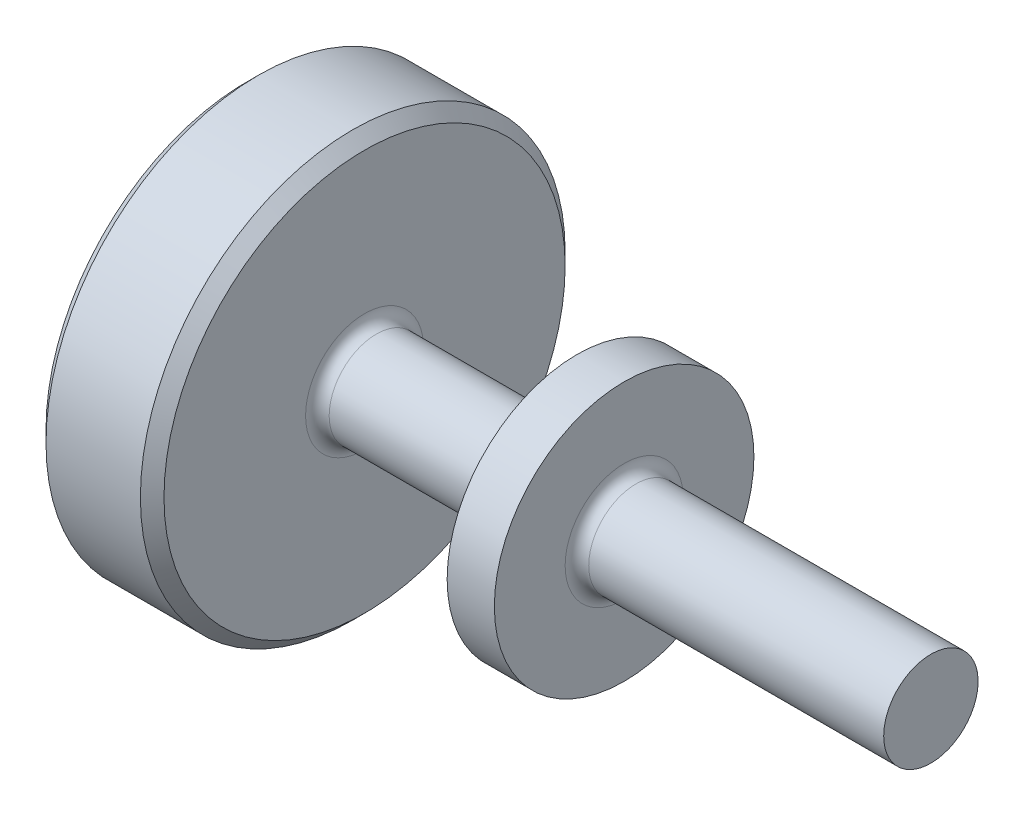
ISO-10303-21;
HEADER;
FILE_DESCRIPTION(('STEP AP214'),'2;1');
FILE_NAME('part.step','',(''),(''),'','','');
FILE_SCHEMA(('AUTOMOTIVE_DESIGN { 1 0 10303 214 1 1 1 1 }'));
ENDSEC;
DATA;
#1=APPLICATION_CONTEXT('core data for automotive mechanical design processes');
#2=APPLICATION_PROTOCOL_DEFINITION('international standard','automotive_design',2000,#1);
#3=PRODUCT_CONTEXT('',#1,'mechanical');
#4=PRODUCT('Part','Part','',(#3));
#5=PRODUCT_RELATED_PRODUCT_CATEGORY('part','',(#4));
#6=PRODUCT_DEFINITION_FORMATION('','',#4);
#7=PRODUCT_DEFINITION_CONTEXT('part definition',#1,'design');
#8=PRODUCT_DEFINITION('design','',#6,#7);
#9=PRODUCT_DEFINITION_SHAPE('','',#8);
#10=(LENGTH_UNIT() NAMED_UNIT(*) SI_UNIT(.MILLI.,.METRE.));
#11=(NAMED_UNIT(*) PLANE_ANGLE_UNIT() SI_UNIT($,.RADIAN.));
#12=(NAMED_UNIT(*) SI_UNIT($,.STERADIAN.) SOLID_ANGLE_UNIT());
#13=UNCERTAINTY_MEASURE_WITH_UNIT(LENGTH_MEASURE(1.E-05),#10,'distance_accuracy_value','');
#14=(GEOMETRIC_REPRESENTATION_CONTEXT(3) GLOBAL_UNCERTAINTY_ASSIGNED_CONTEXT((#13)) GLOBAL_UNIT_ASSIGNED_CONTEXT((#10,
#11,#12)) REPRESENTATION_CONTEXT('',''));
#15=CARTESIAN_POINT('',(0.,0.,0.));
#16=DIRECTION('',(0.,0.,1.));
#17=DIRECTION('',(1.,0.,0.));
#18=AXIS2_PLACEMENT_3D('',#15,#16,#17);
#19=CARTESIAN_POINT('',(0.,0.,0.));
#20=DIRECTION('',(1.,0.,0.));
#21=DIRECTION('',(0.,0.,-1.));
#22=AXIS2_PLACEMENT_3D('',#19,#20,#21);
#23=PLANE('',#22);
#24=CARTESIAN_POINT('',(0.,0.,0.));
#25=DIRECTION('',(1.,0.,0.));
#26=DIRECTION('',(0.,0.,-1.));
#27=AXIS2_PLACEMENT_3D('',#24,#25,#26);
#28=CIRCLE('',#27,17.);
#29=CARTESIAN_POINT('',(0.,0.,-17.));
#30=VERTEX_POINT('',#29);
#31=EDGE_CURVE('E73',#30,#30,#28,.F.);
#32=ORIENTED_EDGE('',*,*,#31,.T.);
#33=EDGE_LOOP('',(#32));
#34=FACE_BOUND('',#33,.T.);
#35=ADVANCED_FACE('F47',(#34),#23,.F.);
#36=CARTESIAN_POINT('',(0.,0.,0.));
#37=DIRECTION('',(-1.,0.,0.));
#38=DIRECTION('',(0.,0.,1.));
#39=AXIS2_PLACEMENT_3D('',#36,#37,#38);
#40=CYLINDRICAL_SURFACE('',#39,18.);
#41=CARTESIAN_POINT('',(9.00000000000001,0.,0.));
#42=DIRECTION('',(-1.,0.,0.));
#43=DIRECTION('',(0.,0.,1.));
#44=AXIS2_PLACEMENT_3D('',#41,#42,#43);
#45=CIRCLE('',#44,18.);
#46=CARTESIAN_POINT('',(9.00000000000001,0.,18.));
#47=VERTEX_POINT('',#46);
#48=EDGE_CURVE('E79',#47,#47,#45,.T.);
#49=ORIENTED_EDGE('',*,*,#48,.T.);
#50=EDGE_LOOP('',(#49));
#51=FACE_BOUND('',#50,.T.);
#52=CARTESIAN_POINT('',(0.99999999999999,0.,0.));
#53=DIRECTION('',(1.,0.,0.));
#54=DIRECTION('',(0.,0.,-1.));
#55=AXIS2_PLACEMENT_3D('',#52,#53,#54);
#56=CIRCLE('',#55,18.);
#57=CARTESIAN_POINT('',(0.99999999999999,0.,-18.));
#58=VERTEX_POINT('',#57);
#59=EDGE_CURVE('E82',#58,#58,#56,.T.);
#60=ORIENTED_EDGE('',*,*,#59,.T.);
#61=EDGE_LOOP('',(#60));
#62=FACE_BOUND('',#61,.T.);
#63=ADVANCED_FACE('F114',(#51,#62),#40,.T.);
#64=CARTESIAN_POINT('',(10.,18.,0.));
#65=DIRECTION('',(-1.,0.,0.));
#66=DIRECTION('',(0.,0.,1.));
#67=AXIS2_PLACEMENT_3D('',#64,#65,#66);
#68=PLANE('',#67);
#69=CARTESIAN_POINT('',(10.,0.,0.));
#70=DIRECTION('',(-1.,0.,0.));
#71=DIRECTION('',(0.,0.,1.));
#72=AXIS2_PLACEMENT_3D('',#69,#70,#71);
#73=CIRCLE('',#72,5.);
#74=CARTESIAN_POINT('',(10.,0.,5.));
#75=VERTEX_POINT('',#74);
#76=EDGE_CURVE('E10',#75,#75,#73,.T.);
#77=ORIENTED_EDGE('',*,*,#76,.T.);
#78=EDGE_LOOP('',(#77));
#79=FACE_BOUND('',#78,.T.);
#80=CARTESIAN_POINT('',(10.,0.,0.));
#81=DIRECTION('',(-1.,0.,0.));
#82=DIRECTION('',(0.,0.,1.));
#83=AXIS2_PLACEMENT_3D('',#80,#81,#82);
#84=CIRCLE('',#83,17.);
#85=CARTESIAN_POINT('',(10.,0.,17.));
#86=VERTEX_POINT('',#85);
#87=EDGE_CURVE('E76',#86,#86,#84,.F.);
#88=ORIENTED_EDGE('',*,*,#87,.T.);
#89=EDGE_LOOP('',(#88));
#90=FACE_BOUND('',#89,.T.);
#91=ADVANCED_FACE('F120',(#79,#90),#68,.F.);
#92=CARTESIAN_POINT('',(0.,0.,0.));
#93=DIRECTION('',(-1.,0.,0.));
#94=DIRECTION('',(0.,0.,1.));
#95=AXIS2_PLACEMENT_3D('',#92,#93,#94);
#96=CYLINDRICAL_SURFACE('',#95,4.);
#97=CARTESIAN_POINT('',(27.,0.,0.));
#98=DIRECTION('',(1.,0.,0.));
#99=DIRECTION('',(0.,0.,-1.));
#100=AXIS2_PLACEMENT_3D('',#97,#98,#99);
#101=CIRCLE('',#100,4.);
#102=CARTESIAN_POINT('',(27.,0.,-4.));
#103=VERTEX_POINT('',#102);
#104=EDGE_CURVE('E58',#103,#103,#101,.F.);
#105=ORIENTED_EDGE('',*,*,#104,.T.);
#106=EDGE_LOOP('',(#105));
#107=FACE_BOUND('',#106,.T.);
#108=CARTESIAN_POINT('',(11.,0.,0.));
#109=DIRECTION('',(-1.,0.,0.));
#110=DIRECTION('',(0.,0.,1.));
#111=AXIS2_PLACEMENT_3D('',#108,#109,#110);
#112=CIRCLE('',#111,4.);
#113=CARTESIAN_POINT('',(11.,0.,4.));
#114=VERTEX_POINT('',#113);
#115=EDGE_CURVE('E62',#114,#114,#112,.F.);
#116=ORIENTED_EDGE('',*,*,#115,.T.);
#117=EDGE_LOOP('',(#116));
#118=FACE_BOUND('',#117,.T.);
#119=ADVANCED_FACE('F147',(#107,#118),#96,.T.);
#120=CARTESIAN_POINT('',(28.,4.,0.));
#121=DIRECTION('',(1.,0.,0.));
#122=DIRECTION('',(0.,0.,-1.));
#123=AXIS2_PLACEMENT_3D('',#120,#121,#122);
#124=PLANE('',#123);
#125=CARTESIAN_POINT('',(28.,0.,0.));
#126=DIRECTION('',(1.,0.,0.));
#127=DIRECTION('',(0.,0.,-1.));
#128=AXIS2_PLACEMENT_3D('',#125,#126,#127);
#129=CIRCLE('',#128,5.);
#130=CARTESIAN_POINT('',(28.,0.,-5.));
#131=VERTEX_POINT('',#130);
#132=EDGE_CURVE('E54',#131,#131,#129,.T.);
#133=ORIENTED_EDGE('',*,*,#132,.T.);
#134=EDGE_LOOP('',(#133));
#135=FACE_BOUND('',#134,.T.);
#136=CARTESIAN_POINT('',(28.,0.,0.));
#137=DIRECTION('',(-1.,0.,0.));
#138=DIRECTION('',(0.,0.,1.));
#139=AXIS2_PLACEMENT_3D('',#136,#137,#138);
#140=CIRCLE('',#139,11.);
#141=CARTESIAN_POINT('',(28.,0.,11.));
#142=VERTEX_POINT('',#141);
#143=EDGE_CURVE('E85',#142,#142,#140,.T.);
#144=ORIENTED_EDGE('',*,*,#143,.T.);
#145=EDGE_LOOP('',(#144));
#146=FACE_BOUND('',#145,.T.);
#147=ADVANCED_FACE('F150',(#135,#146),#124,.F.);
#148=CARTESIAN_POINT('',(0.,0.,0.));
#149=DIRECTION('',(-1.,0.,0.));
#150=DIRECTION('',(0.,0.,1.));
#151=AXIS2_PLACEMENT_3D('',#148,#149,#150);
#152=CYLINDRICAL_SURFACE('',#151,11.);
#153=ORIENTED_EDGE('',*,*,#143,.F.);
#154=EDGE_LOOP('',(#153));
#155=FACE_BOUND('',#154,.T.);
#156=CARTESIAN_POINT('',(32.,0.,0.));
#157=DIRECTION('',(-1.,0.,0.));
#158=DIRECTION('',(0.,0.,1.));
#159=AXIS2_PLACEMENT_3D('',#156,#157,#158);
#160=CIRCLE('',#159,11.);
#161=CARTESIAN_POINT('',(32.,0.,11.));
#162=VERTEX_POINT('',#161);
#163=EDGE_CURVE('E88',#162,#162,#160,.T.);
#164=ORIENTED_EDGE('',*,*,#163,.T.);
#165=EDGE_LOOP('',(#164));
#166=FACE_BOUND('',#165,.T.);
#167=ADVANCED_FACE('F158',(#155,#166),#152,.T.);
#168=CARTESIAN_POINT('',(32.,11.,0.));
#169=DIRECTION('',(-1.,0.,0.));
#170=DIRECTION('',(0.,0.,1.));
#171=AXIS2_PLACEMENT_3D('',#168,#169,#170);
#172=PLANE('',#171);
#173=CARTESIAN_POINT('',(32.,0.,0.));
#174=DIRECTION('',(-1.,0.,0.));
#175=DIRECTION('',(0.,0.,1.));
#176=AXIS2_PLACEMENT_3D('',#173,#174,#175);
#177=CIRCLE('',#176,5.00000000000001);
#178=CARTESIAN_POINT('',(32.,0.,5.00000000000001));
#179=VERTEX_POINT('',#178);
#180=EDGE_CURVE('E70',#179,#179,#177,.T.);
#181=ORIENTED_EDGE('',*,*,#180,.T.);
#182=EDGE_LOOP('',(#181));
#183=FACE_BOUND('',#182,.T.);
#184=ORIENTED_EDGE('',*,*,#163,.F.);
#185=EDGE_LOOP('',(#184));
#186=FACE_BOUND('',#185,.T.);
#187=ADVANCED_FACE('F110',(#183,#186),#172,.F.);
#188=CARTESIAN_POINT('',(0.,0.,0.));
#189=DIRECTION('',(-1.,0.,0.));
#190=DIRECTION('',(0.,0.,1.));
#191=AXIS2_PLACEMENT_3D('',#188,#189,#190);
#192=CYLINDRICAL_SURFACE('',#191,4.00000000000001);
#193=CARTESIAN_POINT('',(33.,0.,0.));
#194=DIRECTION('',(-1.,0.,0.));
#195=DIRECTION('',(0.,0.,1.));
#196=AXIS2_PLACEMENT_3D('',#193,#194,#195);
#197=CIRCLE('',#196,4.00000000000001);
#198=CARTESIAN_POINT('',(33.,0.,4.00000000000001));
#199=VERTEX_POINT('',#198);
#200=EDGE_CURVE('E67',#199,#199,#197,.F.);
#201=ORIENTED_EDGE('',*,*,#200,.T.);
#202=EDGE_LOOP('',(#201));
#203=FACE_BOUND('',#202,.T.);
#204=CARTESIAN_POINT('',(58.,0.,0.));
#205=DIRECTION('',(-1.,0.,0.));
#206=DIRECTION('',(0.,0.,1.));
#207=AXIS2_PLACEMENT_3D('',#204,#205,#206);
#208=CIRCLE('',#207,4.00000000000003);
#209=CARTESIAN_POINT('',(58.,0.,4.00000000000003));
#210=VERTEX_POINT('',#209);
#211=EDGE_CURVE('E91',#210,#210,#208,.T.);
#212=ORIENTED_EDGE('',*,*,#211,.T.);
#213=EDGE_LOOP('',(#212));
#214=FACE_BOUND('',#213,.T.);
#215=ADVANCED_FACE('F95',(#203,#214),#192,.T.);
#216=CARTESIAN_POINT('',(58.,4.00000000000003,0.));
#217=DIRECTION('',(-1.,0.,0.));
#218=DIRECTION('',(0.,0.,1.));
#219=AXIS2_PLACEMENT_3D('',#216,#217,#218);
#220=PLANE('',#219);
#221=ORIENTED_EDGE('',*,*,#211,.F.);
#222=EDGE_LOOP('',(#221));
#223=FACE_BOUND('',#222,.T.);
#224=ADVANCED_FACE('F97',(#223),#220,.F.);
#225=CARTESIAN_POINT('',(9.00000000000001,0.,0.));
#226=DIRECTION('',(-1.,0.,0.));
#227=DIRECTION('',(0.,0.,1.));
#228=AXIS2_PLACEMENT_3D('',#225,#226,#227);
#229=CONICAL_SURFACE('',#228,18.,0.785398163397452);
#230=ORIENTED_EDGE('',*,*,#87,.F.);
#231=EDGE_LOOP('',(#230));
#232=FACE_BOUND('',#231,.T.);
#233=ORIENTED_EDGE('',*,*,#48,.F.);
#234=EDGE_LOOP('',(#233));
#235=FACE_BOUND('',#234,.T.);
#236=ADVANCED_FACE('F99',(#232,#235),#229,.T.);
#237=CARTESIAN_POINT('',(0.,0.,0.));
#238=DIRECTION('',(1.,0.,0.));
#239=DIRECTION('',(0.,0.,-1.));
#240=AXIS2_PLACEMENT_3D('',#237,#238,#239);
#241=CONICAL_SURFACE('',#240,17.,0.785398163397445);
#242=ORIENTED_EDGE('',*,*,#59,.F.);
#243=EDGE_LOOP('',(#242));
#244=FACE_BOUND('',#243,.T.);
#245=ORIENTED_EDGE('',*,*,#31,.F.);
#246=EDGE_LOOP('',(#245));
#247=FACE_BOUND('',#246,.T.);
#248=ADVANCED_FACE('F106',(#244,#247),#241,.T.);
#249=CARTESIAN_POINT('',(33.,0.,0.));
#250=DIRECTION('',(-1.,0.,0.));
#251=DIRECTION('',(0.,0.,1.));
#252=AXIS2_PLACEMENT_3D('',#249,#250,#251);
#253=TOROIDAL_SURFACE('',#252,5.00000000000001,1.);
#254=ORIENTED_EDGE('',*,*,#200,.F.);
#255=EDGE_LOOP('',(#254));
#256=FACE_BOUND('',#255,.T.);
#257=ORIENTED_EDGE('',*,*,#180,.F.);
#258=EDGE_LOOP('',(#257));
#259=FACE_BOUND('',#258,.T.);
#260=ADVANCED_FACE('F133',(#256,#259),#253,.F.);
#261=CARTESIAN_POINT('',(27.,0.,0.));
#262=DIRECTION('',(1.,0.,0.));
#263=DIRECTION('',(0.,0.,-1.));
#264=AXIS2_PLACEMENT_3D('',#261,#262,#263);
#265=TOROIDAL_SURFACE('',#264,5.,1.);
#266=ORIENTED_EDGE('',*,*,#132,.F.);
#267=EDGE_LOOP('',(#266));
#268=FACE_BOUND('',#267,.T.);
#269=ORIENTED_EDGE('',*,*,#104,.F.);
#270=EDGE_LOOP('',(#269));
#271=FACE_BOUND('',#270,.T.);
#272=ADVANCED_FACE('F136',(#268,#271),#265,.F.);
#273=CARTESIAN_POINT('',(11.,0.,0.));
#274=DIRECTION('',(-1.,0.,0.));
#275=DIRECTION('',(0.,0.,1.));
#276=AXIS2_PLACEMENT_3D('',#273,#274,#275);
#277=TOROIDAL_SURFACE('',#276,5.,1.);
#278=ORIENTED_EDGE('',*,*,#115,.F.);
#279=EDGE_LOOP('',(#278));
#280=FACE_BOUND('',#279,.T.);
#281=ORIENTED_EDGE('',*,*,#76,.F.);
#282=EDGE_LOOP('',(#281));
#283=FACE_BOUND('',#282,.T.);
#284=ADVANCED_FACE('F49',(#280,#283),#277,.F.);
#285=CLOSED_SHELL('',(#35,#63,#91,#119,#147,#167,#187,#215,#224,#236,#248,#260,#272,#284));
#286=MANIFOLD_SOLID_BREP('B2',#285);
#287=ADVANCED_BREP_SHAPE_REPRESENTATION('',(#18,#286),#14);
#288=SHAPE_DEFINITION_REPRESENTATION(#9,#287);
ENDSEC;
END-ISO-10303-21;
